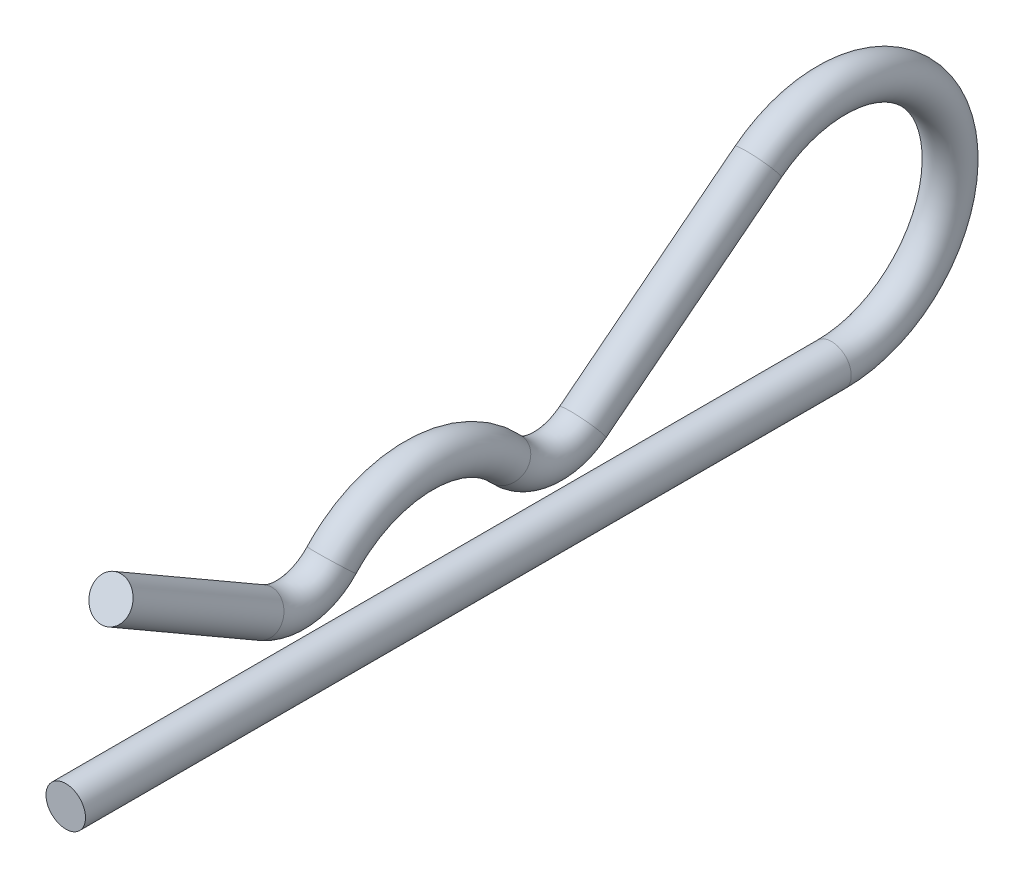
ISO-10303-21;
HEADER;
FILE_DESCRIPTION(('STEP AP214'),'2;1');
FILE_NAME('part.step','',(''),(''),'','','');
FILE_SCHEMA(('AUTOMOTIVE_DESIGN { 1 0 10303 214 1 1 1 1 }'));
ENDSEC;
DATA;
#1=APPLICATION_CONTEXT('core data for automotive mechanical design processes');
#2=APPLICATION_PROTOCOL_DEFINITION('international standard','automotive_design',2000,#1);
#3=PRODUCT_CONTEXT('',#1,'mechanical');
#4=PRODUCT('Part','Part','',(#3));
#5=PRODUCT_RELATED_PRODUCT_CATEGORY('part','',(#4));
#6=PRODUCT_DEFINITION_FORMATION('','',#4);
#7=PRODUCT_DEFINITION_CONTEXT('part definition',#1,'design');
#8=PRODUCT_DEFINITION('design','',#6,#7);
#9=PRODUCT_DEFINITION_SHAPE('','',#8);
#10=(LENGTH_UNIT() NAMED_UNIT(*) SI_UNIT(.MILLI.,.METRE.));
#11=(NAMED_UNIT(*) PLANE_ANGLE_UNIT() SI_UNIT($,.RADIAN.));
#12=(NAMED_UNIT(*) SI_UNIT($,.STERADIAN.) SOLID_ANGLE_UNIT());
#13=UNCERTAINTY_MEASURE_WITH_UNIT(LENGTH_MEASURE(1.E-05),#10,'distance_accuracy_value','');
#14=(GEOMETRIC_REPRESENTATION_CONTEXT(3) GLOBAL_UNCERTAINTY_ASSIGNED_CONTEXT((#13)) GLOBAL_UNIT_ASSIGNED_CONTEXT((#10,
#11,#12)) REPRESENTATION_CONTEXT('',''));
#15=CARTESIAN_POINT('',(0.,0.,0.));
#16=DIRECTION('',(0.,0.,1.));
#17=DIRECTION('',(1.,0.,0.));
#18=AXIS2_PLACEMENT_3D('',#15,#16,#17);
#19=CARTESIAN_POINT('',(0.,3.52564170347306,-9.91614042800487));
#20=DIRECTION('',(0.,0.499999999999991,0.866025403784444));
#21=DIRECTION('',(0.,-0.866025403784444,0.499999999999991));
#22=AXIS2_PLACEMENT_3D('',#19,#20,#21);
#23=CYLINDRICAL_SURFACE('',#22,1.);
#24=CARTESIAN_POINT('',(0.,3.52564170347306,-9.91614042800487));
#25=DIRECTION('',(0.,-0.499999999999977,-0.866025403784452));
#26=DIRECTION('',(1.,0.,0.));
#27=AXIS2_PLACEMENT_3D('',#24,#25,#26);
#28=CIRCLE('',#27,1.);
#29=CARTESIAN_POINT('',(0.,2.65961629968864,-9.41614042800486));
#30=VERTEX_POINT('',#29);
#31=EDGE_CURVE('E40',#30,#30,#28,.T.);
#32=ORIENTED_EDGE('',*,*,#31,.F.);
#33=EDGE_LOOP('',(#32));
#34=FACE_BOUND('',#33,.T.);
#35=CARTESIAN_POINT('',(0.,7.93090533353626,-2.28599999999993));
#36=DIRECTION('',(0.,-0.499999999999977,-0.866025403784452));
#37=DIRECTION('',(1.,0.,0.));
#38=AXIS2_PLACEMENT_3D('',#35,#36,#37);
#39=CIRCLE('',#38,1.);
#40=CARTESIAN_POINT('',(1.,7.93090533353626,-2.28599999999993));
#41=VERTEX_POINT('',#40);
#42=EDGE_CURVE('E10',#41,#41,#39,.T.);
#43=ORIENTED_EDGE('',*,*,#42,.T.);
#44=EDGE_LOOP('',(#43));
#45=FACE_BOUND('',#44,.T.);
#46=ADVANCED_FACE('F34',(#34,#45),#23,.T.);
#47=CARTESIAN_POINT('',(0.,6.,-11.3447118565764));
#48=DIRECTION('',(-1.,0.,0.));
#49=DIRECTION('',(0.,0.,1.));
#50=AXIS2_PLACEMENT_3D('',#47,#48,#49);
#51=TOROIDAL_SURFACE('',#50,2.85714285714285,1.);
#52=CARTESIAN_POINT('',(0.,4.06451612903219,-13.4464177092936));
#53=DIRECTION('',(0.,0.735597048451068,-0.677419354838698));
#54=DIRECTION('',(1.,0.,0.));
#55=AXIS2_PLACEMENT_3D('',#52,#53,#54);
#56=CIRCLE('',#55,1.);
#57=CARTESIAN_POINT('',(0.,3.38709677419346,-14.1820147577446));
#58=VERTEX_POINT('',#57);
#59=EDGE_CURVE('E44',#58,#58,#56,.T.);
#60=CARTESIAN_POINT('',(0.,6.,-11.3447118565764));
#61=DIRECTION('',(-1.,0.,0.));
#62=DIRECTION('',(0.,0.,1.));
#63=AXIS2_PLACEMENT_3D('',#60,#61,#62);
#64=CIRCLE('',#63,3.85714285714285);
#65=EDGE_CURVE('',#58,#30,#64,.T.);
#66=ORIENTED_EDGE('',*,*,#59,.F.);
#67=ORIENTED_EDGE('',*,*,#31,.T.);
#68=ORIENTED_EDGE('',*,*,#65,.T.);
#69=ORIENTED_EDGE('',*,*,#65,.F.);
#70=EDGE_LOOP('',(#66,#68,#67,#69));
#71=FACE_BOUND('',#70,.T.);
#72=ADVANCED_FACE('F90',(#71),#51,.T.);
#73=CARTESIAN_POINT('',(0.,0.,-17.86));
#74=DIRECTION('',(1.,0.,0.));
#75=DIRECTION('',(0.,0.,-1.));
#76=AXIS2_PLACEMENT_3D('',#73,#74,#75);
#77=TOROIDAL_SURFACE('',#76,6.00000000000001,1.);
#78=CARTESIAN_POINT('',(0.,4.06451612903233,-22.2735822907063));
#79=DIRECTION('',(0.,-0.735597048451046,-0.677419354838722));
#80=DIRECTION('',(1.,0.,0.));
#81=AXIS2_PLACEMENT_3D('',#78,#79,#80);
#82=CIRCLE('',#81,1.);
#83=CARTESIAN_POINT('',(0.,3.38709677419364,-21.5379852422552));
#84=VERTEX_POINT('',#83);
#85=EDGE_CURVE('E48',#84,#84,#82,.T.);
#86=ORIENTED_EDGE('',*,*,#85,.F.);
#87=EDGE_LOOP('',(#86));
#88=FACE_BOUND('',#87,.T.);
#89=ORIENTED_EDGE('',*,*,#59,.T.);
#90=EDGE_LOOP('',(#89));
#91=FACE_BOUND('',#90,.T.);
#92=ADVANCED_FACE('F84',(#88,#91),#77,.T.);
#93=CARTESIAN_POINT('',(0.,6.,-24.3752881434236));
#94=DIRECTION('',(-1.,0.,0.));
#95=DIRECTION('',(0.,0.,1.));
#96=AXIS2_PLACEMENT_3D('',#93,#94,#95);
#97=TOROIDAL_SURFACE('',#96,2.85714285714285,1.);
#98=CARTESIAN_POINT('',(0.,3.75254256561587,-26.1394311043976));
#99=DIRECTION('',(0.,0.617450036340915,-0.786610102034421));
#100=DIRECTION('',(1.,0.,0.));
#101=AXIS2_PLACEMENT_3D('',#98,#99,#100);
#102=CIRCLE('',#101,1.);
#103=CARTESIAN_POINT('',(0.,2.96593246358142,-26.7568811407385));
#104=VERTEX_POINT('',#103);
#105=EDGE_CURVE('E53',#104,#104,#102,.T.);
#106=CARTESIAN_POINT('',(0.,6.,-24.3752881434236));
#107=DIRECTION('',(-1.,0.,0.));
#108=DIRECTION('',(0.,0.,1.));
#109=AXIS2_PLACEMENT_3D('',#106,#107,#108);
#110=CIRCLE('',#109,3.85714285714285);
#111=EDGE_CURVE('',#104,#84,#110,.T.);
#112=ORIENTED_EDGE('',*,*,#105,.F.);
#113=ORIENTED_EDGE('',*,*,#85,.T.);
#114=ORIENTED_EDGE('',*,*,#111,.T.);
#115=ORIENTED_EDGE('',*,*,#111,.F.);
#116=EDGE_LOOP('',(#112,#114,#113,#115));
#117=FACE_BOUND('',#116,.T.);
#118=ADVANCED_FACE('F78',(#117),#97,.T.);
#119=CARTESIAN_POINT('',(0.,10.7196606122065,-35.0152997819545));
#120=DIRECTION('',(0.,-0.617450036340904,0.786610102034431));
#121=DIRECTION('',(0.,-0.78661010203443,-0.617450036340903));
#122=AXIS2_PLACEMENT_3D('',#119,#120,#121);
#123=CYLINDRICAL_SURFACE('',#122,1.);
#124=CARTESIAN_POINT('',(0.,10.7196606122065,-35.0152997819545));
#125=DIRECTION('',(0.,0.617450036340915,-0.786610102034421));
#126=DIRECTION('',(1.,0.,0.));
#127=AXIS2_PLACEMENT_3D('',#124,#125,#126);
#128=CIRCLE('',#127,1.);
#129=CARTESIAN_POINT('',(0.,11.506270714241,-34.3978497456136));
#130=VERTEX_POINT('',#129);
#131=EDGE_CURVE('E56',#130,#130,#128,.T.);
#132=ORIENTED_EDGE('',*,*,#131,.F.);
#133=EDGE_LOOP('',(#132));
#134=FACE_BOUND('',#133,.T.);
#135=ORIENTED_EDGE('',*,*,#105,.T.);
#136=EDGE_LOOP('',(#135));
#137=FACE_BOUND('',#136,.T.);
#138=ADVANCED_FACE('F72',(#134,#137),#123,.T.);
#139=CARTESIAN_POINT('',(0.,6.00000000000001,-38.72));
#140=DIRECTION('',(1.,0.,0.));
#141=DIRECTION('',(0.,0.,-1.));
#142=AXIS2_PLACEMENT_3D('',#139,#140,#141);
#143=TOROIDAL_SURFACE('',#142,6.,1.);
#144=CARTESIAN_POINT('',(0.,0.,-38.72));
#145=DIRECTION('',(0.,0.,1.));
#146=DIRECTION('',(1.,0.,0.));
#147=AXIS2_PLACEMENT_3D('',#144,#145,#146);
#148=CIRCLE('',#147,1.);
#149=CARTESIAN_POINT('',(0.,-0.999999999999997,-38.72));
#150=VERTEX_POINT('',#149);
#151=EDGE_CURVE('E59',#150,#150,#148,.T.);
#152=CARTESIAN_POINT('',(0.,6.00000000000001,-38.72));
#153=DIRECTION('',(1.,0.,0.));
#154=DIRECTION('',(0.,0.,-1.));
#155=AXIS2_PLACEMENT_3D('',#152,#153,#154);
#156=CIRCLE('',#155,7.);
#157=EDGE_CURVE('',#150,#130,#156,.T.);
#158=ORIENTED_EDGE('',*,*,#151,.F.);
#159=ORIENTED_EDGE('',*,*,#131,.T.);
#160=ORIENTED_EDGE('',*,*,#157,.T.);
#161=ORIENTED_EDGE('',*,*,#157,.F.);
#162=EDGE_LOOP('',(#158,#160,#159,#161));
#163=FACE_BOUND('',#162,.T.);
#164=ADVANCED_FACE('F69',(#163),#143,.T.);
#165=CARTESIAN_POINT('',(0.,0.,-38.72));
#166=DIRECTION('',(0.,0.,1.));
#167=DIRECTION('',(0.,-1.,0.));
#168=AXIS2_PLACEMENT_3D('',#165,#166,#167);
#169=CYLINDRICAL_SURFACE('',#168,1.);
#170=CARTESIAN_POINT('',(0.,0.,0.));
#171=DIRECTION('',(0.,0.,1.));
#172=DIRECTION('',(1.,0.,0.));
#173=AXIS2_PLACEMENT_3D('',#170,#171,#172);
#174=CIRCLE('',#173,1.);
#175=CARTESIAN_POINT('',(0.,-1.,0.));
#176=VERTEX_POINT('',#175);
#177=EDGE_CURVE('E60',#176,#176,#174,.T.);
#178=CARTESIAN_POINT('',(0.,-0.999999999999997,-38.72));
#179=CARTESIAN_POINT('',(0.,-0.999999999999996,-38.3166666666667));
#180=CARTESIAN_POINT('',(0.,-0.999999999999997,-37.9133333333333));
#181=CARTESIAN_POINT('',(0.,-0.999999999999997,-37.1066666666667));
#182=CARTESIAN_POINT('',(0.,-0.999999999999997,-36.7033333333333));
#183=CARTESIAN_POINT('',(0.,-0.999999999999997,-35.8966666666667));
#184=CARTESIAN_POINT('',(0.,-0.999999999999997,-35.4933333333333));
#185=CARTESIAN_POINT('',(0.,-0.999999999999997,-34.6866666666667));
#186=CARTESIAN_POINT('',(0.,-0.999999999999997,-34.2833333333333));
#187=CARTESIAN_POINT('',(0.,-0.999999999999997,-33.4766666666667));
#188=CARTESIAN_POINT('',(0.,-0.999999999999997,-33.0733333333333));
#189=CARTESIAN_POINT('',(0.,-0.999999999999997,-32.2666666666667));
#190=CARTESIAN_POINT('',(0.,-0.999999999999997,-31.8633333333333));
#191=CARTESIAN_POINT('',(0.,-0.999999999999997,-31.0566666666667));
#192=CARTESIAN_POINT('',(0.,-0.999999999999997,-30.6533333333333));
#193=CARTESIAN_POINT('',(0.,-0.999999999999997,-29.8466666666667));
#194=CARTESIAN_POINT('',(0.,-0.999999999999997,-29.4433333333333));
#195=CARTESIAN_POINT('',(0.,-0.999999999999997,-28.6366666666667));
#196=CARTESIAN_POINT('',(0.,-0.999999999999997,-28.2333333333333));
#197=CARTESIAN_POINT('',(0.,-0.999999999999997,-27.4266666666667));
#198=CARTESIAN_POINT('',(0.,-0.999999999999998,-27.0233333333333));
#199=CARTESIAN_POINT('',(0.,-0.999999999999998,-26.2166666666667));
#200=CARTESIAN_POINT('',(0.,-0.999999999999998,-25.8133333333333));
#201=CARTESIAN_POINT('',(0.,-0.999999999999998,-25.0066666666667));
#202=CARTESIAN_POINT('',(0.,-0.999999999999998,-24.6033333333333));
#203=CARTESIAN_POINT('',(0.,-0.999999999999998,-23.7966666666667));
#204=CARTESIAN_POINT('',(0.,-0.999999999999998,-23.3933333333333));
#205=CARTESIAN_POINT('',(0.,-0.999999999999998,-22.5866666666667));
#206=CARTESIAN_POINT('',(0.,-0.999999999999998,-22.1833333333333));
#207=CARTESIAN_POINT('',(0.,-0.999999999999998,-21.3766666666667));
#208=CARTESIAN_POINT('',(0.,-0.999999999999998,-20.9733333333333));
#209=CARTESIAN_POINT('',(0.,-0.999999999999998,-20.1666666666667));
#210=CARTESIAN_POINT('',(0.,-0.999999999999998,-19.7633333333333));
#211=CARTESIAN_POINT('',(0.,-0.999999999999998,-18.9566666666667));
#212=CARTESIAN_POINT('',(0.,-0.999999999999998,-18.5533333333333));
#213=CARTESIAN_POINT('',(0.,-0.999999999999998,-17.7466666666667));
#214=CARTESIAN_POINT('',(0.,-0.999999999999999,-17.3433333333333));
#215=CARTESIAN_POINT('',(0.,-0.999999999999999,-16.5366666666667));
#216=CARTESIAN_POINT('',(0.,-0.999999999999999,-16.1333333333333));
#217=CARTESIAN_POINT('',(0.,-0.999999999999999,-15.3266666666667));
#218=CARTESIAN_POINT('',(0.,-0.999999999999999,-14.9233333333333));
#219=CARTESIAN_POINT('',(0.,-0.999999999999999,-14.1166666666667));
#220=CARTESIAN_POINT('',(0.,-0.999999999999999,-13.7133333333333));
#221=CARTESIAN_POINT('',(0.,-0.999999999999999,-12.9066666666667));
#222=CARTESIAN_POINT('',(0.,-0.999999999999999,-12.5033333333333));
#223=CARTESIAN_POINT('',(0.,-0.999999999999999,-11.6966666666667));
#224=CARTESIAN_POINT('',(0.,-0.999999999999999,-11.2933333333333));
#225=CARTESIAN_POINT('',(0.,-0.999999999999999,-10.4866666666667));
#226=CARTESIAN_POINT('',(0.,-0.999999999999999,-10.0833333333333));
#227=CARTESIAN_POINT('',(0.,-0.999999999999999,-9.27666666666667));
#228=CARTESIAN_POINT('',(0.,-0.999999999999999,-8.87333333333333));
#229=CARTESIAN_POINT('',(0.,-0.999999999999999,-8.06666666666667));
#230=CARTESIAN_POINT('',(0.,-0.999999999999999,-7.66333333333334));
#231=CARTESIAN_POINT('',(0.,-0.999999999999999,-6.85666666666667));
#232=CARTESIAN_POINT('',(0.,-1.,-6.45333333333333));
#233=CARTESIAN_POINT('',(0.,-1.,-5.64666666666667));
#234=CARTESIAN_POINT('',(0.,-1.,-5.24333333333333));
#235=CARTESIAN_POINT('',(0.,-1.,-4.43666666666666));
#236=CARTESIAN_POINT('',(0.,-1.,-4.03333333333333));
#237=CARTESIAN_POINT('',(0.,-1.,-3.22666666666667));
#238=CARTESIAN_POINT('',(0.,-1.,-2.82333333333333));
#239=CARTESIAN_POINT('',(0.,-1.,-2.01666666666667));
#240=CARTESIAN_POINT('',(0.,-1.,-1.61333333333333));
#241=CARTESIAN_POINT('',(0.,-1.,-0.806666666666668));
#242=CARTESIAN_POINT('',(0.,-1.,-0.403333333333334));
#243=CARTESIAN_POINT('',(0.,-1.,0.));
#244=B_SPLINE_CURVE_WITH_KNOTS('',3,(#178,#179,#180,#181,#182,#183,#184,#185,#186,#187,#188,
#189,#190,#191,#192,#193,#194,#195,#196,#197,#198,#199,#200,#201,#202,#203,#204,#205,#206,#207,
#208,#209,#210,#211,#212,#213,#214,#215,#216,#217,#218,#219,#220,#221,#222,#223,#224,#225,#226,
#227,#228,#229,#230,#231,#232,#233,#234,#235,#236,#237,#238,#239,#240,#241,#242,#243),
.UNSPECIFIED.,.F.,.F.,(4,2,2,2,2,2,2,2,2,2,2,2,2,2,2,2,2,2,2,2,2,2,2,2,2,2,2,2,2,2,2,2,4),(0.,
1.21,2.42,3.62999999999999,4.84,6.04999999999999,7.26,8.47,9.67999999999999,10.89,12.1,13.31,
14.52,15.73,16.94,18.15,19.36,20.57,21.78,22.99,24.2,25.41,26.62,27.83,29.04,30.25,31.46,32.67,
33.88,35.09,36.3,37.51,38.72),.UNSPECIFIED.);
#245=EDGE_CURVE('BSEAM66',#150,#176,#244,.T.);
#246=ORIENTED_EDGE('',*,*,#151,.T.);
#247=ORIENTED_EDGE('',*,*,#177,.F.);
#248=ORIENTED_EDGE('',*,*,#245,.T.);
#249=ORIENTED_EDGE('',*,*,#245,.F.);
#250=EDGE_LOOP('',(#246,#248,#247,#249));
#251=FACE_BOUND('',#250,.T.);
#252=ADVANCED_FACE('F66',(#251),#169,.T.);
#253=CARTESIAN_POINT('',(0.,7.93090533353626,-2.28599999999993));
#254=DIRECTION('',(0.,-0.499999999999977,-0.866025403784452));
#255=DIRECTION('',(1.,0.,0.));
#256=AXIS2_PLACEMENT_3D('',#253,#254,#255);
#257=PLANE('',#256);
#258=ORIENTED_EDGE('',*,*,#42,.F.);
#259=EDGE_LOOP('',(#258));
#260=FACE_BOUND('',#259,.T.);
#261=ADVANCED_FACE('F102',(#260),#257,.F.);
#262=CARTESIAN_POINT('',(0.,0.,0.));
#263=DIRECTION('',(0.,0.,1.));
#264=DIRECTION('',(1.,0.,0.));
#265=AXIS2_PLACEMENT_3D('',#262,#263,#264);
#266=PLANE('',#265);
#267=ORIENTED_EDGE('',*,*,#177,.T.);
#268=EDGE_LOOP('',(#267));
#269=FACE_BOUND('',#268,.T.);
#270=ADVANCED_FACE('F103',(#269),#266,.T.);
#271=CLOSED_SHELL('',(#46,#72,#92,#118,#138,#164,#252,#261,#270));
#272=MANIFOLD_SOLID_BREP('B2',#271);
#273=ADVANCED_BREP_SHAPE_REPRESENTATION('',(#18,#272),#14);
#274=SHAPE_DEFINITION_REPRESENTATION(#9,#273);
ENDSEC;
END-ISO-10303-21;
